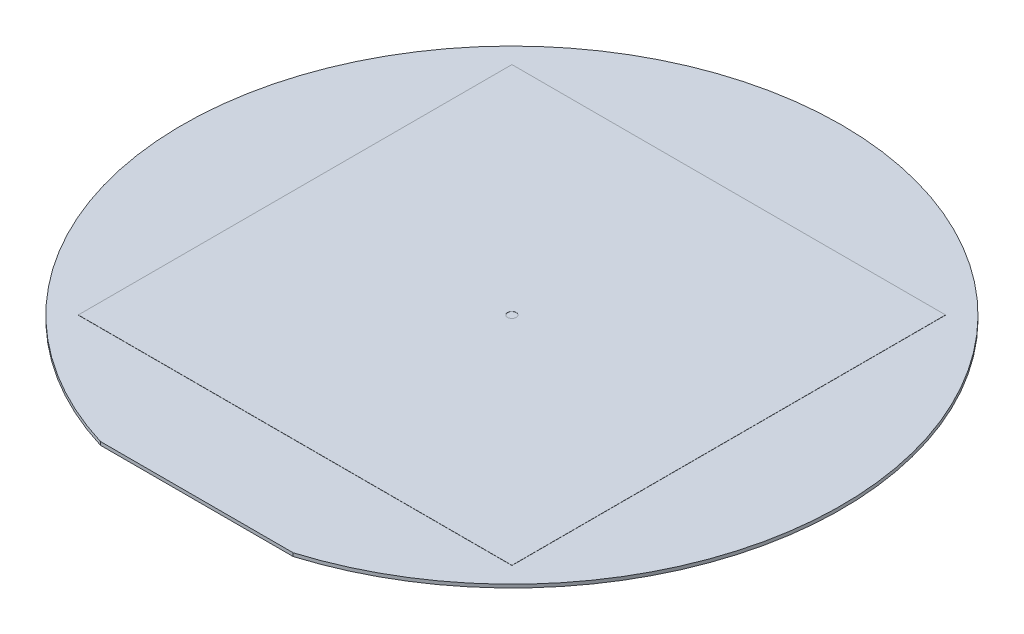
ISO-10303-21;
HEADER;
FILE_DESCRIPTION(('STEP AP214'),'2;1');
FILE_NAME('part.step','',(''),(''),'','','');
FILE_SCHEMA(('AUTOMOTIVE_DESIGN { 1 0 10303 214 1 1 1 1 }'));
ENDSEC;
DATA;
#1=APPLICATION_CONTEXT('core data for automotive mechanical design processes');
#2=APPLICATION_PROTOCOL_DEFINITION('international standard','automotive_design',2000,#1);
#3=PRODUCT_CONTEXT('',#1,'mechanical');
#4=PRODUCT('Part','Part','',(#3));
#5=PRODUCT_RELATED_PRODUCT_CATEGORY('part','',(#4));
#6=PRODUCT_DEFINITION_FORMATION('','',#4);
#7=PRODUCT_DEFINITION_CONTEXT('part definition',#1,'design');
#8=PRODUCT_DEFINITION('design','',#6,#7);
#9=PRODUCT_DEFINITION_SHAPE('','',#8);
#10=(LENGTH_UNIT() NAMED_UNIT(*) SI_UNIT(.MILLI.,.METRE.));
#11=(NAMED_UNIT(*) PLANE_ANGLE_UNIT() SI_UNIT($,.RADIAN.));
#12=(NAMED_UNIT(*) SI_UNIT($,.STERADIAN.) SOLID_ANGLE_UNIT());
#13=UNCERTAINTY_MEASURE_WITH_UNIT(LENGTH_MEASURE(1.E-05),#10,'distance_accuracy_value','');
#14=(GEOMETRIC_REPRESENTATION_CONTEXT(3) GLOBAL_UNCERTAINTY_ASSIGNED_CONTEXT((#13)) GLOBAL_UNIT_ASSIGNED_CONTEXT((#10,
#11,#12)) REPRESENTATION_CONTEXT('',''));
#15=CARTESIAN_POINT('',(0.,0.,0.));
#16=DIRECTION('',(0.,0.,1.));
#17=DIRECTION('',(1.,0.,0.));
#18=AXIS2_PLACEMENT_3D('',#15,#16,#17);
#19=CARTESIAN_POINT('',(0.,0.4,0.));
#20=DIRECTION('',(0.,1.,0.));
#21=DIRECTION('',(0.,0.,1.));
#22=AXIS2_PLACEMENT_3D('',#19,#20,#21);
#23=PLANE('',#22);
#24=DIRECTION('',(0.,0.,-1.));
#25=VECTOR('',#24,1.);
#26=CARTESIAN_POINT('',(25.,0.4,-25.));
#27=LINE('',#26,#25);
#28=CARTESIAN_POINT('',(25.,0.4,25.));
#29=VERTEX_POINT('',#28);
#30=CARTESIAN_POINT('',(25.,0.4,-25.));
#31=VERTEX_POINT('',#30);
#32=EDGE_CURVE('E144',#29,#31,#27,.T.);
#33=ORIENTED_EDGE('',*,*,#32,.T.);
#34=DIRECTION('',(-1.,0.,0.));
#35=VECTOR('',#34,1.);
#36=CARTESIAN_POINT('',(-25.,0.4,-25.));
#37=LINE('',#36,#35);
#38=CARTESIAN_POINT('',(-25.,0.4,-25.));
#39=VERTEX_POINT('',#38);
#40=EDGE_CURVE('E147',#31,#39,#37,.T.);
#41=ORIENTED_EDGE('',*,*,#40,.T.);
#42=DIRECTION('',(0.,0.,1.));
#43=VECTOR('',#42,1.);
#44=CARTESIAN_POINT('',(-25.,0.4,-25.));
#45=LINE('',#44,#43);
#46=CARTESIAN_POINT('',(-25.,0.4,25.));
#47=VERTEX_POINT('',#46);
#48=EDGE_CURVE('E150',#39,#47,#45,.T.);
#49=ORIENTED_EDGE('',*,*,#48,.T.);
#50=DIRECTION('',(1.,0.,0.));
#51=VECTOR('',#50,1.);
#52=CARTESIAN_POINT('',(-25.,0.4,25.));
#53=LINE('',#52,#51);
#54=EDGE_CURVE('E69',#47,#29,#53,.T.);
#55=ORIENTED_EDGE('',*,*,#54,.T.);
#56=EDGE_LOOP('',(#33,#41,#49,#55));
#57=FACE_BOUND('',#56,.T.);
#58=CARTESIAN_POINT('',(0.,0.4,0.));
#59=DIRECTION('',(0.,1.,0.));
#60=DIRECTION('',(0.,0.,1.));
#61=AXIS2_PLACEMENT_3D('',#58,#59,#60);
#62=CIRCLE('',#61,0.5);
#63=CARTESIAN_POINT('',(0.,0.4,0.499999999999997));
#64=VERTEX_POINT('',#63);
#65=EDGE_CURVE('E140',#64,#64,#62,.T.);
#66=ORIENTED_EDGE('',*,*,#65,.F.);
#67=EDGE_LOOP('',(#66));
#68=FACE_BOUND('',#67,.T.);
#69=ADVANCED_FACE('F45',(#57,#68),#23,.T.);
#70=CARTESIAN_POINT('',(25.,0.4,-25.));
#71=DIRECTION('',(-1.,0.,0.));
#72=DIRECTION('',(0.,0.,1.));
#73=AXIS2_PLACEMENT_3D('',#70,#71,#72);
#74=PLANE('',#73);
#75=DIRECTION('',(0.,-1.,0.));
#76=VECTOR('',#75,1.);
#77=CARTESIAN_POINT('',(25.,0.4,25.));
#78=LINE('',#77,#76);
#79=CARTESIAN_POINT('',(25.,0.381,25.));
#80=VERTEX_POINT('',#79);
#81=EDGE_CURVE('E155',#29,#80,#78,.T.);
#82=ORIENTED_EDGE('',*,*,#81,.T.);
#83=DIRECTION('',(0.,0.,-1.));
#84=VECTOR('',#83,1.);
#85=CARTESIAN_POINT('',(25.,0.381,-25.));
#86=LINE('',#85,#84);
#87=CARTESIAN_POINT('',(25.,0.381,-25.));
#88=VERTEX_POINT('',#87);
#89=EDGE_CURVE('E61',#80,#88,#86,.T.);
#90=ORIENTED_EDGE('',*,*,#89,.T.);
#91=DIRECTION('',(0.,-1.,0.));
#92=VECTOR('',#91,1.);
#93=CARTESIAN_POINT('',(25.,0.4,-25.));
#94=LINE('',#93,#92);
#95=EDGE_CURVE('E54',#31,#88,#94,.T.);
#96=ORIENTED_EDGE('',*,*,#95,.F.);
#97=ORIENTED_EDGE('',*,*,#32,.F.);
#98=EDGE_LOOP('',(#82,#90,#96,#97));
#99=FACE_BOUND('',#98,.T.);
#100=ADVANCED_FACE('F47',(#99),#74,.F.);
#101=CARTESIAN_POINT('',(-25.,0.4,-25.));
#102=DIRECTION('',(0.,0.,1.));
#103=DIRECTION('',(1.,0.,0.));
#104=AXIS2_PLACEMENT_3D('',#101,#102,#103);
#105=PLANE('',#104);
#106=ORIENTED_EDGE('',*,*,#95,.T.);
#107=DIRECTION('',(-1.,0.,0.));
#108=VECTOR('',#107,1.);
#109=CARTESIAN_POINT('',(-25.,0.381,-25.));
#110=LINE('',#109,#108);
#111=CARTESIAN_POINT('',(-25.,0.381,-25.));
#112=VERTEX_POINT('',#111);
#113=EDGE_CURVE('E134',#88,#112,#110,.T.);
#114=ORIENTED_EDGE('',*,*,#113,.T.);
#115=DIRECTION('',(0.,-1.,0.));
#116=VECTOR('',#115,1.);
#117=CARTESIAN_POINT('',(-25.,0.4,-25.));
#118=LINE('',#117,#116);
#119=EDGE_CURVE('E163',#39,#112,#118,.T.);
#120=ORIENTED_EDGE('',*,*,#119,.F.);
#121=ORIENTED_EDGE('',*,*,#40,.F.);
#122=EDGE_LOOP('',(#106,#114,#120,#121));
#123=FACE_BOUND('',#122,.T.);
#124=ADVANCED_FACE('F170',(#123),#105,.F.);
#125=CARTESIAN_POINT('',(-25.,0.4,-25.));
#126=DIRECTION('',(1.,0.,0.));
#127=DIRECTION('',(0.,0.,-1.));
#128=AXIS2_PLACEMENT_3D('',#125,#126,#127);
#129=PLANE('',#128);
#130=ORIENTED_EDGE('',*,*,#119,.T.);
#131=DIRECTION('',(0.,0.,1.));
#132=VECTOR('',#131,1.);
#133=CARTESIAN_POINT('',(-25.,0.381,-25.));
#134=LINE('',#133,#132);
#135=CARTESIAN_POINT('',(-25.,0.381,25.));
#136=VERTEX_POINT('',#135);
#137=EDGE_CURVE('E126',#112,#136,#134,.T.);
#138=ORIENTED_EDGE('',*,*,#137,.T.);
#139=DIRECTION('',(0.,-1.,0.));
#140=VECTOR('',#139,1.);
#141=CARTESIAN_POINT('',(-25.,0.4,25.));
#142=LINE('',#141,#140);
#143=EDGE_CURVE('E159',#47,#136,#142,.T.);
#144=ORIENTED_EDGE('',*,*,#143,.F.);
#145=ORIENTED_EDGE('',*,*,#48,.F.);
#146=EDGE_LOOP('',(#130,#138,#144,#145));
#147=FACE_BOUND('',#146,.T.);
#148=ADVANCED_FACE('F178',(#147),#129,.F.);
#149=CARTESIAN_POINT('',(-25.,0.4,25.));
#150=DIRECTION('',(0.,0.,-1.));
#151=DIRECTION('',(-1.,0.,0.));
#152=AXIS2_PLACEMENT_3D('',#149,#150,#151);
#153=PLANE('',#152);
#154=ORIENTED_EDGE('',*,*,#143,.T.);
#155=DIRECTION('',(1.,0.,0.));
#156=VECTOR('',#155,1.);
#157=CARTESIAN_POINT('',(-25.,0.381,25.));
#158=LINE('',#157,#156);
#159=EDGE_CURVE('E122',#136,#80,#158,.T.);
#160=ORIENTED_EDGE('',*,*,#159,.T.);
#161=ORIENTED_EDGE('',*,*,#81,.F.);
#162=ORIENTED_EDGE('',*,*,#54,.F.);
#163=EDGE_LOOP('',(#154,#160,#161,#162));
#164=FACE_BOUND('',#163,.T.);
#165=ADVANCED_FACE('F175',(#164),#153,.F.);
#166=CARTESIAN_POINT('',(0.,0.4,0.));
#167=DIRECTION('',(0.,-1.,0.));
#168=DIRECTION('',(0.,0.,-1.));
#169=AXIS2_PLACEMENT_3D('',#166,#167,#168);
#170=CYLINDRICAL_SURFACE('',#169,0.5);
#171=CARTESIAN_POINT('',(0.,0.381,0.));
#172=DIRECTION('',(0.,1.,0.));
#173=DIRECTION('',(0.,0.,1.));
#174=AXIS2_PLACEMENT_3D('',#171,#172,#173);
#175=CIRCLE('',#174,0.5);
#176=CARTESIAN_POINT('',(0.,0.381,0.499999999999997));
#177=VERTEX_POINT('',#176);
#178=EDGE_CURVE('E11',#177,#177,#175,.T.);
#179=ORIENTED_EDGE('',*,*,#178,.F.);
#180=EDGE_LOOP('',(#179));
#181=FACE_BOUND('',#180,.T.);
#182=ORIENTED_EDGE('',*,*,#65,.T.);
#183=EDGE_LOOP('',(#182));
#184=FACE_BOUND('',#183,.T.);
#185=ADVANCED_FACE('F185',(#181,#184),#170,.F.);
#186=CARTESIAN_POINT('',(0.,0.381,0.));
#187=DIRECTION('',(0.,1.,0.));
#188=DIRECTION('',(0.,0.,1.));
#189=AXIS2_PLACEMENT_3D('',#186,#187,#188);
#190=PLANE('',#189);
#191=ORIENTED_EDGE('',*,*,#178,.T.);
#192=EDGE_LOOP('',(#191));
#193=FACE_BOUND('',#192,.T.);
#194=ADVANCED_FACE('F187',(#193),#190,.T.);
#195=CARTESIAN_POINT('',(0.,0.381,36.3396188752717));
#196=DIRECTION('',(0.,0.,-1.));
#197=DIRECTION('',(-1.,0.,0.));
#198=AXIS2_PLACEMENT_3D('',#195,#196,#197);
#199=PLANE('',#198);
#200=DIRECTION('',(1.,0.,0.));
#201=VECTOR('',#200,1.);
#202=CARTESIAN_POINT('',(0.,0.,36.3396188752717));
#203=LINE('',#202,#201);
#204=CARTESIAN_POINT('',(-11.11,0.,36.3396188752717));
#205=VERTEX_POINT('',#204);
#206=CARTESIAN_POINT('',(11.11,0.,36.3396188752717));
#207=VERTEX_POINT('',#206);
#208=EDGE_CURVE('E120',#205,#207,#203,.T.);
#209=ORIENTED_EDGE('',*,*,#208,.T.);
#210=DIRECTION('',(0.,-1.,0.));
#211=VECTOR('',#210,1.);
#212=CARTESIAN_POINT('',(11.11,0.381,36.3396188752717));
#213=LINE('',#212,#211);
#214=CARTESIAN_POINT('',(11.11,0.381,36.3396188752717));
#215=VERTEX_POINT('',#214);
#216=EDGE_CURVE('E104',#215,#207,#213,.T.);
#217=ORIENTED_EDGE('',*,*,#216,.F.);
#218=DIRECTION('',(1.,0.,0.));
#219=VECTOR('',#218,1.);
#220=CARTESIAN_POINT('',(0.,0.381,36.3396188752717));
#221=LINE('',#220,#219);
#222=CARTESIAN_POINT('',(-11.11,0.381,36.3396188752717));
#223=VERTEX_POINT('',#222);
#224=EDGE_CURVE('E111',#223,#215,#221,.T.);
#225=ORIENTED_EDGE('',*,*,#224,.F.);
#226=DIRECTION('',(0.,-1.,0.));
#227=VECTOR('',#226,1.);
#228=CARTESIAN_POINT('',(-11.11,0.381,36.3396188752717));
#229=LINE('',#228,#227);
#230=EDGE_CURVE('E107',#223,#205,#229,.T.);
#231=ORIENTED_EDGE('',*,*,#230,.T.);
#232=EDGE_LOOP('',(#209,#217,#225,#231));
#233=FACE_BOUND('',#232,.T.);
#234=ADVANCED_FACE('F118',(#233),#199,.F.);
#235=CARTESIAN_POINT('',(0.,0.381,0.));
#236=DIRECTION('',(0.,-1.,0.));
#237=DIRECTION('',(0.,0.,-1.));
#238=AXIS2_PLACEMENT_3D('',#235,#236,#237);
#239=CYLINDRICAL_SURFACE('',#238,38.);
#240=CARTESIAN_POINT('',(0.,0.,0.));
#241=DIRECTION('',(0.,1.,0.));
#242=DIRECTION('',(0.,0.,1.));
#243=AXIS2_PLACEMENT_3D('',#240,#241,#242);
#244=CIRCLE('',#243,38.);
#245=EDGE_CURVE('E116',#207,#205,#244,.T.);
#246=ORIENTED_EDGE('',*,*,#245,.T.);
#247=ORIENTED_EDGE('',*,*,#230,.F.);
#248=CARTESIAN_POINT('',(0.,0.381,0.));
#249=DIRECTION('',(0.,1.,0.));
#250=DIRECTION('',(0.,0.,1.));
#251=AXIS2_PLACEMENT_3D('',#248,#249,#250);
#252=CIRCLE('',#251,38.);
#253=EDGE_CURVE('E100',#215,#223,#252,.T.);
#254=ORIENTED_EDGE('',*,*,#253,.F.);
#255=ORIENTED_EDGE('',*,*,#216,.T.);
#256=EDGE_LOOP('',(#246,#247,#254,#255));
#257=FACE_BOUND('',#256,.T.);
#258=ADVANCED_FACE('F102',(#257),#239,.T.);
#259=ORIENTED_EDGE('',*,*,#89,.F.);
#260=ORIENTED_EDGE('',*,*,#159,.F.);
#261=ORIENTED_EDGE('',*,*,#137,.F.);
#262=ORIENTED_EDGE('',*,*,#113,.F.);
#263=EDGE_LOOP('',(#259,#260,#261,#262));
#264=FACE_BOUND('',#263,.T.);
#265=ORIENTED_EDGE('',*,*,#224,.T.);
#266=ORIENTED_EDGE('',*,*,#253,.T.);
#267=EDGE_LOOP('',(#265,#266));
#268=FACE_BOUND('',#267,.T.);
#269=ADVANCED_FACE('F113',(#264,#268),#190,.T.);
#270=CARTESIAN_POINT('',(0.,0.,0.));
#271=DIRECTION('',(0.,1.,0.));
#272=DIRECTION('',(0.,0.,1.));
#273=AXIS2_PLACEMENT_3D('',#270,#271,#272);
#274=PLANE('',#273);
#275=ORIENTED_EDGE('',*,*,#208,.F.);
#276=ORIENTED_EDGE('',*,*,#245,.F.);
#277=EDGE_LOOP('',(#275,#276));
#278=FACE_BOUND('',#277,.T.);
#279=ADVANCED_FACE('F201',(#278),#274,.F.);
#280=CLOSED_SHELL('',(#69,#100,#124,#148,#165,#185,#194,#234,#258,#269,#279));
#281=MANIFOLD_SOLID_BREP('B2',#280);
#282=ADVANCED_BREP_SHAPE_REPRESENTATION('',(#18,#281),#14);
#283=SHAPE_DEFINITION_REPRESENTATION(#9,#282);
ENDSEC;
END-ISO-10303-21;
